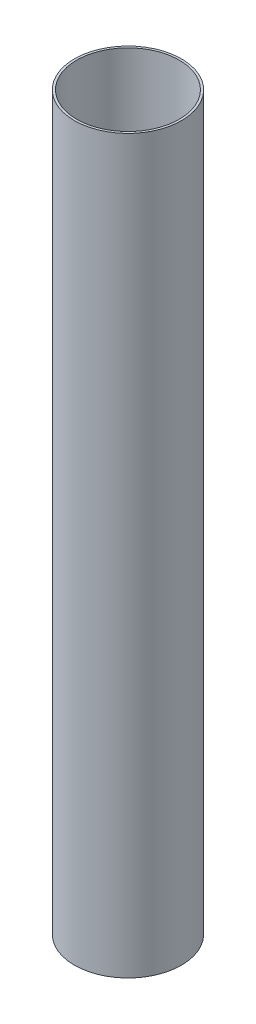
ISO-10303-21;
HEADER;
FILE_DESCRIPTION(('STEP AP214'),'2;1');
FILE_NAME('part.step','',(''),(''),'','','');
FILE_SCHEMA(('AUTOMOTIVE_DESIGN { 1 0 10303 214 1 1 1 1 }'));
ENDSEC;
DATA;
#1=APPLICATION_CONTEXT('core data for automotive mechanical design processes');
#2=APPLICATION_PROTOCOL_DEFINITION('international standard','automotive_design',2000,#1);
#3=PRODUCT_CONTEXT('',#1,'mechanical');
#4=PRODUCT('Part','Part','',(#3));
#5=PRODUCT_RELATED_PRODUCT_CATEGORY('part','',(#4));
#6=PRODUCT_DEFINITION_FORMATION('','',#4);
#7=PRODUCT_DEFINITION_CONTEXT('part definition',#1,'design');
#8=PRODUCT_DEFINITION('design','',#6,#7);
#9=PRODUCT_DEFINITION_SHAPE('','',#8);
#10=(LENGTH_UNIT() NAMED_UNIT(*) SI_UNIT(.MILLI.,.METRE.));
#11=(NAMED_UNIT(*) PLANE_ANGLE_UNIT() SI_UNIT($,.RADIAN.));
#12=(NAMED_UNIT(*) SI_UNIT($,.STERADIAN.) SOLID_ANGLE_UNIT());
#13=UNCERTAINTY_MEASURE_WITH_UNIT(LENGTH_MEASURE(1.E-05),#10,'distance_accuracy_value','');
#14=(GEOMETRIC_REPRESENTATION_CONTEXT(3) GLOBAL_UNCERTAINTY_ASSIGNED_CONTEXT((#13)) GLOBAL_UNIT_ASSIGNED_CONTEXT((#10,
#11,#12)) REPRESENTATION_CONTEXT('',''));
#15=CARTESIAN_POINT('',(0.,0.,0.));
#16=DIRECTION('',(0.,0.,1.));
#17=DIRECTION('',(1.,0.,0.));
#18=AXIS2_PLACEMENT_3D('',#15,#16,#17);
#19=CARTESIAN_POINT('',(0.,1041.4,0.));
#20=DIRECTION('',(0.,1.,0.));
#21=DIRECTION('',(0.,0.,1.));
#22=AXIS2_PLACEMENT_3D('',#19,#20,#21);
#23=PLANE('',#22);
#24=CARTESIAN_POINT('',(0.,1041.4,0.));
#25=DIRECTION('',(0.,1.,0.));
#26=DIRECTION('',(0.,0.,1.));
#27=AXIS2_PLACEMENT_3D('',#24,#25,#26);
#28=CIRCLE('',#27,76.2);
#29=CARTESIAN_POINT('',(0.,1041.4,76.2));
#30=VERTEX_POINT('',#29);
#31=EDGE_CURVE('E10',#30,#30,#28,.T.);
#32=ORIENTED_EDGE('',*,*,#31,.T.);
#33=EDGE_LOOP('',(#32));
#34=FACE_BOUND('',#33,.T.);
#35=CARTESIAN_POINT('',(0.,1041.4,0.));
#36=DIRECTION('',(0.,1.,0.));
#37=DIRECTION('',(0.,0.,1.));
#38=AXIS2_PLACEMENT_3D('',#35,#36,#37);
#39=CIRCLE('',#38,73.025);
#40=CARTESIAN_POINT('',(0.,1041.4,73.025));
#41=VERTEX_POINT('',#40);
#42=EDGE_CURVE('E56',#41,#41,#39,.T.);
#43=ORIENTED_EDGE('',*,*,#42,.F.);
#44=EDGE_LOOP('',(#43));
#45=FACE_BOUND('',#44,.T.);
#46=ADVANCED_FACE('F44',(#34,#45),#23,.T.);
#47=CARTESIAN_POINT('',(0.,0.,0.));
#48=DIRECTION('',(0.,1.,0.));
#49=DIRECTION('',(0.,0.,1.));
#50=AXIS2_PLACEMENT_3D('',#47,#48,#49);
#51=PLANE('',#50);
#52=CARTESIAN_POINT('',(0.,0.,0.));
#53=DIRECTION('',(0.,1.,0.));
#54=DIRECTION('',(0.,0.,1.));
#55=AXIS2_PLACEMENT_3D('',#52,#53,#54);
#56=CIRCLE('',#55,76.2);
#57=CARTESIAN_POINT('',(0.,0.,76.2));
#58=VERTEX_POINT('',#57);
#59=EDGE_CURVE('E47',#58,#58,#56,.T.);
#60=ORIENTED_EDGE('',*,*,#59,.F.);
#61=EDGE_LOOP('',(#60));
#62=FACE_BOUND('',#61,.T.);
#63=CARTESIAN_POINT('',(0.,0.,0.));
#64=DIRECTION('',(0.,1.,0.));
#65=DIRECTION('',(0.,0.,1.));
#66=AXIS2_PLACEMENT_3D('',#63,#64,#65);
#67=CIRCLE('',#66,73.025);
#68=CARTESIAN_POINT('',(0.,0.,73.025));
#69=VERTEX_POINT('',#68);
#70=EDGE_CURVE('E63',#69,#69,#67,.T.);
#71=ORIENTED_EDGE('',*,*,#70,.T.);
#72=EDGE_LOOP('',(#71));
#73=FACE_BOUND('',#72,.T.);
#74=ADVANCED_FACE('F75',(#62,#73),#51,.F.);
#75=CARTESIAN_POINT('',(0.,1041.4,0.));
#76=DIRECTION('',(0.,-1.,0.));
#77=DIRECTION('',(0.,0.,-1.));
#78=AXIS2_PLACEMENT_3D('',#75,#76,#77);
#79=CYLINDRICAL_SURFACE('',#78,76.2);
#80=ORIENTED_EDGE('',*,*,#31,.F.);
#81=EDGE_LOOP('',(#80));
#82=FACE_BOUND('',#81,.T.);
#83=ORIENTED_EDGE('',*,*,#59,.T.);
#84=EDGE_LOOP('',(#83));
#85=FACE_BOUND('',#84,.T.);
#86=ADVANCED_FACE('F50',(#82,#85),#79,.T.);
#87=CARTESIAN_POINT('',(0.,1041.4,0.));
#88=DIRECTION('',(0.,-1.,0.));
#89=DIRECTION('',(0.,0.,-1.));
#90=AXIS2_PLACEMENT_3D('',#87,#88,#89);
#91=CYLINDRICAL_SURFACE('',#90,73.025);
#92=ORIENTED_EDGE('',*,*,#42,.T.);
#93=EDGE_LOOP('',(#92));
#94=FACE_BOUND('',#93,.T.);
#95=ORIENTED_EDGE('',*,*,#70,.F.);
#96=EDGE_LOOP('',(#95));
#97=FACE_BOUND('',#96,.T.);
#98=ADVANCED_FACE('F68',(#94,#97),#91,.F.);
#99=CLOSED_SHELL('',(#46,#74,#86,#98));
#100=MANIFOLD_SOLID_BREP('B2',#99);
#101=ADVANCED_BREP_SHAPE_REPRESENTATION('',(#18,#100),#14);
#102=SHAPE_DEFINITION_REPRESENTATION(#9,#101);
ENDSEC;
END-ISO-10303-21;
